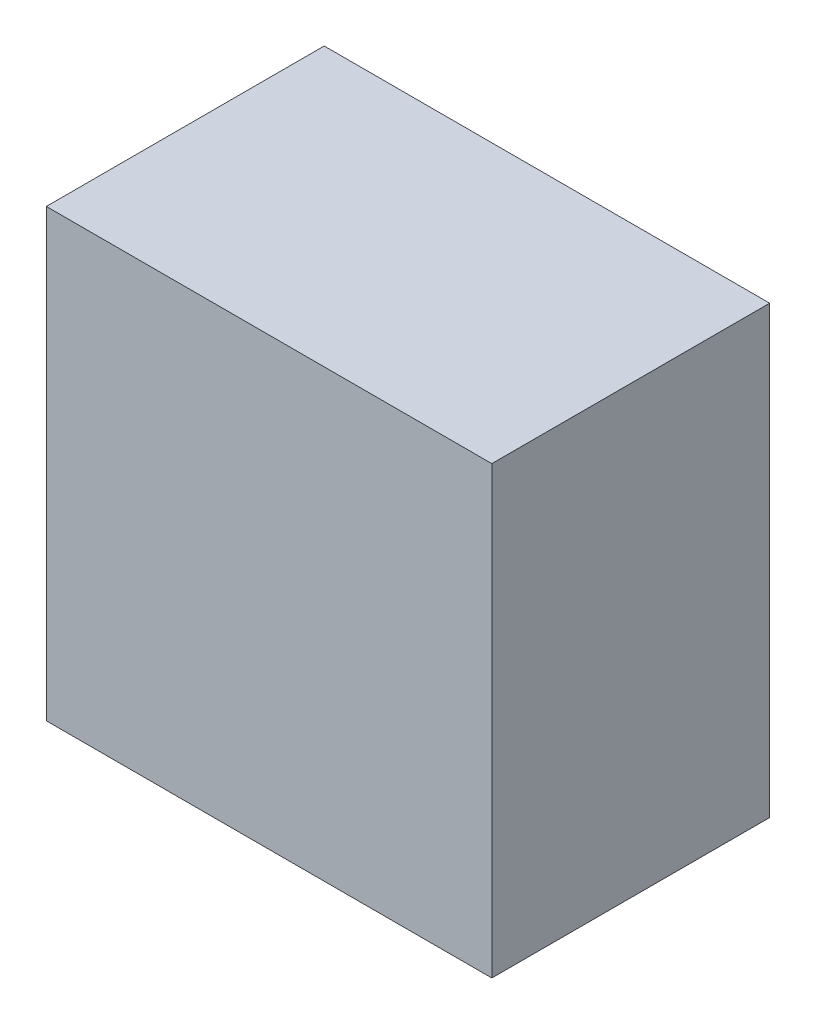
ISO-10303-21;
HEADER;
FILE_DESCRIPTION(('STEP AP214'),'2;1');
FILE_NAME('part.step','',(''),(''),'','','');
FILE_SCHEMA(('AUTOMOTIVE_DESIGN { 1 0 10303 214 1 1 1 1 }'));
ENDSEC;
DATA;
#1=APPLICATION_CONTEXT('core data for automotive mechanical design processes');
#2=APPLICATION_PROTOCOL_DEFINITION('international standard','automotive_design',2000,#1);
#3=PRODUCT_CONTEXT('',#1,'mechanical');
#4=PRODUCT('Part','Part','',(#3));
#5=PRODUCT_RELATED_PRODUCT_CATEGORY('part','',(#4));
#6=PRODUCT_DEFINITION_FORMATION('','',#4);
#7=PRODUCT_DEFINITION_CONTEXT('part definition',#1,'design');
#8=PRODUCT_DEFINITION('design','',#6,#7);
#9=PRODUCT_DEFINITION_SHAPE('','',#8);
#10=(LENGTH_UNIT() NAMED_UNIT(*) SI_UNIT(.MILLI.,.METRE.));
#11=(NAMED_UNIT(*) PLANE_ANGLE_UNIT() SI_UNIT($,.RADIAN.));
#12=(NAMED_UNIT(*) SI_UNIT($,.STERADIAN.) SOLID_ANGLE_UNIT());
#13=UNCERTAINTY_MEASURE_WITH_UNIT(LENGTH_MEASURE(1.E-05),#10,'distance_accuracy_value','');
#14=(GEOMETRIC_REPRESENTATION_CONTEXT(3) GLOBAL_UNCERTAINTY_ASSIGNED_CONTEXT((#13)) GLOBAL_UNIT_ASSIGNED_CONTEXT((#10,
#11,#12)) REPRESENTATION_CONTEXT('',''));
#15=CARTESIAN_POINT('',(0.,0.,0.));
#16=DIRECTION('',(0.,0.,1.));
#17=DIRECTION('',(1.,0.,0.));
#18=AXIS2_PLACEMENT_3D('',#15,#16,#17);
#19=CARTESIAN_POINT('',(-0.8016,-0.8016,1.));
#20=DIRECTION('',(1.,0.,0.));
#21=DIRECTION('',(0.,0.,-1.));
#22=AXIS2_PLACEMENT_3D('',#19,#20,#21);
#23=PLANE('',#22);
#24=DIRECTION('',(0.,-1.,0.));
#25=VECTOR('',#24,1.);
#26=CARTESIAN_POINT('',(-0.8016,-0.8016,0.));
#27=LINE('',#26,#25);
#28=CARTESIAN_POINT('',(-0.8016,0.8016,0.));
#29=VERTEX_POINT('',#28);
#30=CARTESIAN_POINT('',(-0.8016,-0.8016,0.));
#31=VERTEX_POINT('',#30);
#32=EDGE_CURVE('E96',#29,#31,#27,.T.);
#33=ORIENTED_EDGE('',*,*,#32,.T.);
#34=DIRECTION('',(0.,0.,-1.));
#35=VECTOR('',#34,1.);
#36=CARTESIAN_POINT('',(-0.8016,-0.8016,1.));
#37=LINE('',#36,#35);
#38=CARTESIAN_POINT('',(-0.8016,-0.8016,1.));
#39=VERTEX_POINT('',#38);
#40=EDGE_CURVE('E11',#39,#31,#37,.T.);
#41=ORIENTED_EDGE('',*,*,#40,.F.);
#42=DIRECTION('',(0.,-1.,0.));
#43=VECTOR('',#42,1.);
#44=CARTESIAN_POINT('',(-0.8016,-0.8016,1.));
#45=LINE('',#44,#43);
#46=CARTESIAN_POINT('',(-0.8016,0.8016,1.));
#47=VERTEX_POINT('',#46);
#48=EDGE_CURVE('E84',#47,#39,#45,.T.);
#49=ORIENTED_EDGE('',*,*,#48,.F.);
#50=DIRECTION('',(0.,0.,-1.));
#51=VECTOR('',#50,1.);
#52=CARTESIAN_POINT('',(-0.8016,0.8016,1.));
#53=LINE('',#52,#51);
#54=EDGE_CURVE('E92',#47,#29,#53,.T.);
#55=ORIENTED_EDGE('',*,*,#54,.T.);
#56=EDGE_LOOP('',(#33,#41,#49,#55));
#57=FACE_BOUND('',#56,.T.);
#58=ADVANCED_FACE('F33',(#57),#23,.F.);
#59=CARTESIAN_POINT('',(0.8016,-0.8016,1.));
#60=DIRECTION('',(0.,1.,0.));
#61=DIRECTION('',(0.,0.,1.));
#62=AXIS2_PLACEMENT_3D('',#59,#60,#61);
#63=PLANE('',#62);
#64=DIRECTION('',(1.,0.,0.));
#65=VECTOR('',#64,1.);
#66=CARTESIAN_POINT('',(0.8016,-0.8016,0.));
#67=LINE('',#66,#65);
#68=CARTESIAN_POINT('',(0.8016,-0.8016,0.));
#69=VERTEX_POINT('',#68);
#70=EDGE_CURVE('E88',#31,#69,#67,.T.);
#71=ORIENTED_EDGE('',*,*,#70,.T.);
#72=DIRECTION('',(0.,0.,-1.));
#73=VECTOR('',#72,1.);
#74=CARTESIAN_POINT('',(0.8016,-0.8016,1.));
#75=LINE('',#74,#73);
#76=CARTESIAN_POINT('',(0.8016,-0.8016,1.));
#77=VERTEX_POINT('',#76);
#78=EDGE_CURVE('E41',#77,#69,#75,.T.);
#79=ORIENTED_EDGE('',*,*,#78,.F.);
#80=DIRECTION('',(1.,0.,0.));
#81=VECTOR('',#80,1.);
#82=CARTESIAN_POINT('',(0.8016,-0.8016,1.));
#83=LINE('',#82,#81);
#84=EDGE_CURVE('E79',#39,#77,#83,.T.);
#85=ORIENTED_EDGE('',*,*,#84,.F.);
#86=ORIENTED_EDGE('',*,*,#40,.T.);
#87=EDGE_LOOP('',(#71,#79,#85,#86));
#88=FACE_BOUND('',#87,.T.);
#89=ADVANCED_FACE('F87',(#88),#63,.F.);
#90=CARTESIAN_POINT('',(0.8016,0.8016,1.));
#91=DIRECTION('',(-1.,0.,0.));
#92=DIRECTION('',(0.,0.,1.));
#93=AXIS2_PLACEMENT_3D('',#90,#91,#92);
#94=PLANE('',#93);
#95=DIRECTION('',(0.,1.,0.));
#96=VECTOR('',#95,1.);
#97=CARTESIAN_POINT('',(0.8016,0.8016,0.));
#98=LINE('',#97,#96);
#99=CARTESIAN_POINT('',(0.8016,0.8016,0.));
#100=VERTEX_POINT('',#99);
#101=EDGE_CURVE('E66',#69,#100,#98,.T.);
#102=ORIENTED_EDGE('',*,*,#101,.T.);
#103=DIRECTION('',(0.,0.,-1.));
#104=VECTOR('',#103,1.);
#105=CARTESIAN_POINT('',(0.8016,0.8016,1.));
#106=LINE('',#105,#104);
#107=CARTESIAN_POINT('',(0.8016,0.8016,1.));
#108=VERTEX_POINT('',#107);
#109=EDGE_CURVE('E89',#108,#100,#106,.T.);
#110=ORIENTED_EDGE('',*,*,#109,.F.);
#111=DIRECTION('',(0.,1.,0.));
#112=VECTOR('',#111,1.);
#113=CARTESIAN_POINT('',(0.8016,0.8016,1.));
#114=LINE('',#113,#112);
#115=EDGE_CURVE('E82',#77,#108,#114,.T.);
#116=ORIENTED_EDGE('',*,*,#115,.F.);
#117=ORIENTED_EDGE('',*,*,#78,.T.);
#118=EDGE_LOOP('',(#102,#110,#116,#117));
#119=FACE_BOUND('',#118,.T.);
#120=ADVANCED_FACE('F90',(#119),#94,.F.);
#121=CARTESIAN_POINT('',(-0.8016,0.8016,1.));
#122=DIRECTION('',(0.,-1.,0.));
#123=DIRECTION('',(0.,0.,-1.));
#124=AXIS2_PLACEMENT_3D('',#121,#122,#123);
#125=PLANE('',#124);
#126=DIRECTION('',(-1.,0.,0.));
#127=VECTOR('',#126,1.);
#128=CARTESIAN_POINT('',(-0.8016,0.8016,0.));
#129=LINE('',#128,#127);
#130=EDGE_CURVE('E72',#100,#29,#129,.T.);
#131=ORIENTED_EDGE('',*,*,#130,.T.);
#132=ORIENTED_EDGE('',*,*,#54,.F.);
#133=DIRECTION('',(-1.,0.,0.));
#134=VECTOR('',#133,1.);
#135=CARTESIAN_POINT('',(-0.8016,0.8016,1.));
#136=LINE('',#135,#134);
#137=EDGE_CURVE('E49',#108,#47,#136,.T.);
#138=ORIENTED_EDGE('',*,*,#137,.F.);
#139=ORIENTED_EDGE('',*,*,#109,.T.);
#140=EDGE_LOOP('',(#131,#132,#138,#139));
#141=FACE_BOUND('',#140,.T.);
#142=ADVANCED_FACE('F103',(#141),#125,.F.);
#143=CARTESIAN_POINT('',(0.,0.,1.));
#144=DIRECTION('',(0.,0.,-1.));
#145=DIRECTION('',(-1.,0.,0.));
#146=AXIS2_PLACEMENT_3D('',#143,#144,#145);
#147=PLANE('',#146);
#148=ORIENTED_EDGE('',*,*,#48,.T.);
#149=ORIENTED_EDGE('',*,*,#84,.T.);
#150=ORIENTED_EDGE('',*,*,#115,.T.);
#151=ORIENTED_EDGE('',*,*,#137,.T.);
#152=EDGE_LOOP('',(#148,#149,#150,#151));
#153=FACE_BOUND('',#152,.T.);
#154=ADVANCED_FACE('F80',(#153),#147,.F.);
#155=CARTESIAN_POINT('',(0.,0.,0.));
#156=DIRECTION('',(0.,0.,-1.));
#157=DIRECTION('',(-1.,0.,0.));
#158=AXIS2_PLACEMENT_3D('',#155,#156,#157);
#159=PLANE('',#158);
#160=ORIENTED_EDGE('',*,*,#32,.F.);
#161=ORIENTED_EDGE('',*,*,#130,.F.);
#162=ORIENTED_EDGE('',*,*,#101,.F.);
#163=ORIENTED_EDGE('',*,*,#70,.F.);
#164=EDGE_LOOP('',(#160,#161,#162,#163));
#165=FACE_BOUND('',#164,.T.);
#166=ADVANCED_FACE('F106',(#165),#159,.T.);
#167=CLOSED_SHELL('',(#58,#89,#120,#142,#154,#166));
#168=MANIFOLD_SOLID_BREP('B2',#167);
#169=ADVANCED_BREP_SHAPE_REPRESENTATION('',(#18,#168),#14);
#170=SHAPE_DEFINITION_REPRESENTATION(#9,#169);
ENDSEC;
END-ISO-10303-21;
